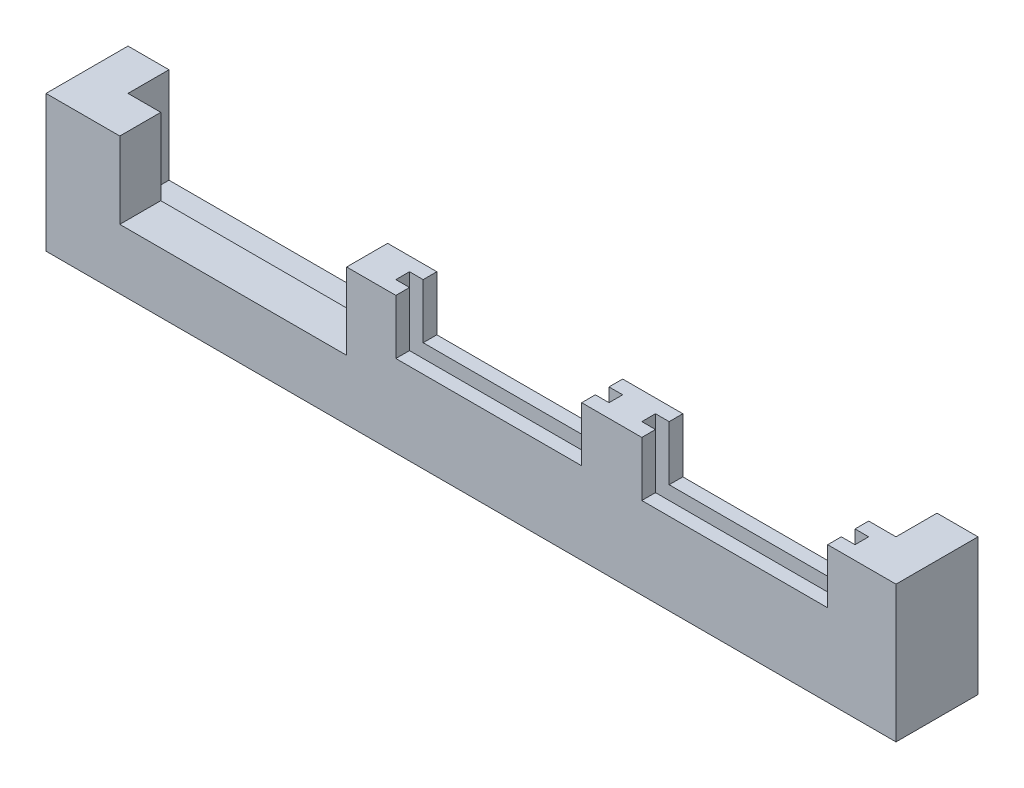
ISO-10303-21;
HEADER;
FILE_DESCRIPTION(('STEP AP214'),'2;1');
FILE_NAME('part.step','',(''),(''),'','','');
FILE_SCHEMA(('AUTOMOTIVE_DESIGN { 1 0 10303 214 1 1 1 1 }'));
ENDSEC;
DATA;
#1=APPLICATION_CONTEXT('core data for automotive mechanical design processes');
#2=APPLICATION_PROTOCOL_DEFINITION('international standard','automotive_design',2000,#1);
#3=PRODUCT_CONTEXT('',#1,'mechanical');
#4=PRODUCT('Part','Part','',(#3));
#5=PRODUCT_RELATED_PRODUCT_CATEGORY('part','',(#4));
#6=PRODUCT_DEFINITION_FORMATION('','',#4);
#7=PRODUCT_DEFINITION_CONTEXT('part definition',#1,'design');
#8=PRODUCT_DEFINITION('design','',#6,#7);
#9=PRODUCT_DEFINITION_SHAPE('','',#8);
#10=(LENGTH_UNIT() NAMED_UNIT(*) SI_UNIT(.MILLI.,.METRE.));
#11=(NAMED_UNIT(*) PLANE_ANGLE_UNIT() SI_UNIT($,.RADIAN.));
#12=(NAMED_UNIT(*) SI_UNIT($,.STERADIAN.) SOLID_ANGLE_UNIT());
#13=UNCERTAINTY_MEASURE_WITH_UNIT(LENGTH_MEASURE(1.E-05),#10,'distance_accuracy_value','');
#14=(GEOMETRIC_REPRESENTATION_CONTEXT(3) GLOBAL_UNCERTAINTY_ASSIGNED_CONTEXT((#13)) GLOBAL_UNIT_ASSIGNED_CONTEXT((#10,
#11,#12)) REPRESENTATION_CONTEXT('',''));
#15=CARTESIAN_POINT('',(0.,0.,0.));
#16=DIRECTION('',(0.,0.,1.));
#17=DIRECTION('',(1.,0.,0.));
#18=AXIS2_PLACEMENT_3D('',#15,#16,#17);
#19=CARTESIAN_POINT('',(27.8217270194986,-10.8422780020317,3.));
#20=DIRECTION('',(1.,0.,0.));
#21=DIRECTION('',(0.,1.,0.));
#22=AXIS2_PLACEMENT_3D('',#19,#20,#21);
#23=PLANE('',#22);
#24=DIRECTION('',(0.,0.,-1.));
#25=VECTOR('',#24,1.);
#26=CARTESIAN_POINT('',(27.8217270194986,-10.8422780020317,3.));
#27=LINE('',#26,#25);
#28=CARTESIAN_POINT('',(27.8217270194986,-10.8422780020317,3.));
#29=VERTEX_POINT('',#28);
#30=CARTESIAN_POINT('',(27.8217270194986,-10.8422780020317,2.));
#31=VERTEX_POINT('',#30);
#32=EDGE_CURVE('E482',#29,#31,#27,.T.);
#33=ORIENTED_EDGE('',*,*,#32,.T.);
#34=DIRECTION('',(0.,-1.,0.));
#35=VECTOR('',#34,1.);
#36=CARTESIAN_POINT('',(27.8217270194986,-10.8422780020317,2.));
#37=LINE('',#36,#35);
#38=CARTESIAN_POINT('',(27.8217270194986,-14.8422780020317,2.));
#39=VERTEX_POINT('',#38);
#40=EDGE_CURVE('E406',#31,#39,#37,.T.);
#41=ORIENTED_EDGE('',*,*,#40,.T.);
#42=DIRECTION('',(0.,0.,-1.));
#43=VECTOR('',#42,1.);
#44=CARTESIAN_POINT('',(27.8217270194986,-14.8422780020317,3.));
#45=LINE('',#44,#43);
#46=CARTESIAN_POINT('',(27.8217270194986,-14.8422780020317,3.));
#47=VERTEX_POINT('',#46);
#48=EDGE_CURVE('E486',#47,#39,#45,.T.);
#49=ORIENTED_EDGE('',*,*,#48,.F.);
#50=DIRECTION('',(0.,-1.,0.));
#51=VECTOR('',#50,1.);
#52=CARTESIAN_POINT('',(27.8217270194986,-10.8422780020317,3.));
#53=LINE('',#52,#51);
#54=EDGE_CURVE('E282',#29,#47,#53,.T.);
#55=ORIENTED_EDGE('',*,*,#54,.F.);
#56=EDGE_LOOP('',(#33,#41,#49,#55));
#57=FACE_BOUND('',#56,.T.);
#58=ADVANCED_FACE('F36',(#57),#23,.F.);
#59=CARTESIAN_POINT('',(14.2217270194986,-14.8422780020317,3.));
#60=DIRECTION('',(0.,1.,0.));
#61=DIRECTION('',(-1.,0.,0.));
#62=AXIS2_PLACEMENT_3D('',#59,#60,#61);
#63=PLANE('',#62);
#64=DIRECTION('',(1.,0.,0.));
#65=VECTOR('',#64,1.);
#66=CARTESIAN_POINT('',(14.2217270194986,-14.8422780020317,2.));
#67=LINE('',#66,#65);
#68=CARTESIAN_POINT('',(14.2217270194986,-14.8422780020317,2.));
#69=VERTEX_POINT('',#68);
#70=EDGE_CURVE('E404',#69,#39,#67,.T.);
#71=ORIENTED_EDGE('',*,*,#70,.F.);
#72=DIRECTION('',(0.,0.,-1.));
#73=VECTOR('',#72,1.);
#74=CARTESIAN_POINT('',(14.2217270194986,-14.8422780020317,3.));
#75=LINE('',#74,#73);
#76=CARTESIAN_POINT('',(14.2217270194986,-14.8422780020317,3.));
#77=VERTEX_POINT('',#76);
#78=EDGE_CURVE('E490',#77,#69,#75,.T.);
#79=ORIENTED_EDGE('',*,*,#78,.F.);
#80=DIRECTION('',(1.,0.,0.));
#81=VECTOR('',#80,1.);
#82=CARTESIAN_POINT('',(14.2217270194986,-14.8422780020317,3.));
#83=LINE('',#82,#81);
#84=EDGE_CURVE('E444',#77,#47,#83,.T.);
#85=ORIENTED_EDGE('',*,*,#84,.T.);
#86=ORIENTED_EDGE('',*,*,#48,.T.);
#87=EDGE_LOOP('',(#71,#79,#85,#86));
#88=FACE_BOUND('',#87,.T.);
#89=ADVANCED_FACE('F643',(#88),#63,.T.);
#90=CARTESIAN_POINT('',(14.2217270194986,-10.8422780020317,3.));
#91=DIRECTION('',(1.,0.,0.));
#92=DIRECTION('',(0.,0.,-1.));
#93=AXIS2_PLACEMENT_3D('',#90,#91,#92);
#94=PLANE('',#93);
#95=DIRECTION('',(0.,-1.,0.));
#96=VECTOR('',#95,1.);
#97=CARTESIAN_POINT('',(14.2217270194986,-10.8422780020317,2.));
#98=LINE('',#97,#96);
#99=CARTESIAN_POINT('',(14.2217270194986,-10.8422780020317,2.));
#100=VERTEX_POINT('',#99);
#101=EDGE_CURVE('E402',#100,#69,#98,.T.);
#102=ORIENTED_EDGE('',*,*,#101,.F.);
#103=DIRECTION('',(0.,0.,-1.));
#104=VECTOR('',#103,1.);
#105=CARTESIAN_POINT('',(14.2217270194986,-10.8422780020317,3.));
#106=LINE('',#105,#104);
#107=CARTESIAN_POINT('',(14.2217270194986,-10.8422780020317,3.));
#108=VERTEX_POINT('',#107);
#109=EDGE_CURVE('E494',#108,#100,#106,.T.);
#110=ORIENTED_EDGE('',*,*,#109,.F.);
#111=DIRECTION('',(0.,-1.,0.));
#112=VECTOR('',#111,1.);
#113=CARTESIAN_POINT('',(14.2217270194986,-10.8422780020317,3.));
#114=LINE('',#113,#112);
#115=EDGE_CURVE('E441',#108,#77,#114,.T.);
#116=ORIENTED_EDGE('',*,*,#115,.T.);
#117=ORIENTED_EDGE('',*,*,#78,.T.);
#118=EDGE_LOOP('',(#102,#110,#116,#117));
#119=FACE_BOUND('',#118,.T.);
#120=ADVANCED_FACE('F649',(#119),#94,.T.);
#121=CARTESIAN_POINT('',(9.82172701949864,-10.8422780020317,3.));
#122=DIRECTION('',(1.,0.,0.));
#123=DIRECTION('',(0.,0.,-1.));
#124=AXIS2_PLACEMENT_3D('',#121,#122,#123);
#125=PLANE('',#124);
#126=DIRECTION('',(0.,0.,-1.));
#127=VECTOR('',#126,1.);
#128=CARTESIAN_POINT('',(9.82172701949864,-14.8422780020317,3.));
#129=LINE('',#128,#127);
#130=CARTESIAN_POINT('',(9.82172701949864,-14.8422780020317,0.999999999999991));
#131=VERTEX_POINT('',#130);
#132=CARTESIAN_POINT('',(9.82172701949864,-14.8422780020317,0.));
#133=VERTEX_POINT('',#132);
#134=EDGE_CURVE('E505',#131,#133,#129,.T.);
#135=ORIENTED_EDGE('',*,*,#134,.F.);
#136=DIRECTION('',(0.,1.,0.));
#137=VECTOR('',#136,1.);
#138=CARTESIAN_POINT('',(9.82172701949864,-10.8422780020317,0.999999999999991));
#139=LINE('',#138,#137);
#140=CARTESIAN_POINT('',(9.82172701949864,-10.8422780020317,0.999999999999991));
#141=VERTEX_POINT('',#140);
#142=EDGE_CURVE('E392',#131,#141,#139,.T.);
#143=ORIENTED_EDGE('',*,*,#142,.T.);
#144=DIRECTION('',(0.,0.,-1.));
#145=VECTOR('',#144,1.);
#146=CARTESIAN_POINT('',(9.82172701949864,-10.8422780020317,3.));
#147=LINE('',#146,#145);
#148=CARTESIAN_POINT('',(9.82172701949864,-10.8422780020317,0.));
#149=VERTEX_POINT('',#148);
#150=EDGE_CURVE('E501',#141,#149,#147,.T.);
#151=ORIENTED_EDGE('',*,*,#150,.T.);
#152=DIRECTION('',(0.,-1.,0.));
#153=VECTOR('',#152,1.);
#154=CARTESIAN_POINT('',(9.82172701949864,-10.8422780020317,0.));
#155=LINE('',#154,#153);
#156=EDGE_CURVE('E466',#149,#133,#155,.T.);
#157=ORIENTED_EDGE('',*,*,#156,.T.);
#158=EDGE_LOOP('',(#135,#143,#151,#157));
#159=FACE_BOUND('',#158,.T.);
#160=ADVANCED_FACE('F594',(#159),#125,.F.);
#161=CARTESIAN_POINT('',(-3.77827298050137,-14.8422780020317,3.));
#162=DIRECTION('',(0.,1.,0.));
#163=DIRECTION('',(0.,0.,1.));
#164=AXIS2_PLACEMENT_3D('',#161,#162,#163);
#165=PLANE('',#164);
#166=DIRECTION('',(-1.,0.,0.));
#167=VECTOR('',#166,1.);
#168=CARTESIAN_POINT('',(-3.77827298050137,-14.8422780020317,1.));
#169=LINE('',#168,#167);
#170=CARTESIAN_POINT('',(-3.77827298050137,-14.8422780020317,1.));
#171=VERTEX_POINT('',#170);
#172=EDGE_CURVE('E390',#131,#171,#169,.T.);
#173=ORIENTED_EDGE('',*,*,#172,.F.);
#174=ORIENTED_EDGE('',*,*,#134,.T.);
#175=DIRECTION('',(1.,0.,0.));
#176=VECTOR('',#175,1.);
#177=CARTESIAN_POINT('',(-3.77827298050137,-14.8422780020317,0.));
#178=LINE('',#177,#176);
#179=CARTESIAN_POINT('',(-3.77827298050137,-14.8422780020317,0.));
#180=VERTEX_POINT('',#179);
#181=EDGE_CURVE('E463',#180,#133,#178,.T.);
#182=ORIENTED_EDGE('',*,*,#181,.F.);
#183=DIRECTION('',(0.,0.,-1.));
#184=VECTOR('',#183,1.);
#185=CARTESIAN_POINT('',(-3.77827298050137,-14.8422780020317,3.));
#186=LINE('',#185,#184);
#187=EDGE_CURVE('E509',#171,#180,#186,.T.);
#188=ORIENTED_EDGE('',*,*,#187,.F.);
#189=EDGE_LOOP('',(#173,#174,#182,#188));
#190=FACE_BOUND('',#189,.T.);
#191=ADVANCED_FACE('F661',(#190),#165,.T.);
#192=CARTESIAN_POINT('',(-3.77827298050137,-10.8422780020317,3.));
#193=DIRECTION('',(1.,0.,0.));
#194=DIRECTION('',(0.,1.,0.));
#195=AXIS2_PLACEMENT_3D('',#192,#193,#194);
#196=PLANE('',#195);
#197=DIRECTION('',(0.,1.,0.));
#198=VECTOR('',#197,1.);
#199=CARTESIAN_POINT('',(-3.77827298050137,-10.8422780020317,1.));
#200=LINE('',#199,#198);
#201=CARTESIAN_POINT('',(-3.77827298050137,-10.8422780020317,0.999999999999999));
#202=VERTEX_POINT('',#201);
#203=EDGE_CURVE('E388',#171,#202,#200,.T.);
#204=ORIENTED_EDGE('',*,*,#203,.F.);
#205=ORIENTED_EDGE('',*,*,#187,.T.);
#206=DIRECTION('',(0.,-1.,0.));
#207=VECTOR('',#206,1.);
#208=CARTESIAN_POINT('',(-3.77827298050137,-10.8422780020317,0.));
#209=LINE('',#208,#207);
#210=CARTESIAN_POINT('',(-3.77827298050137,-10.8422780020317,0.));
#211=VERTEX_POINT('',#210);
#212=EDGE_CURVE('E460',#211,#180,#209,.T.);
#213=ORIENTED_EDGE('',*,*,#212,.F.);
#214=DIRECTION('',(0.,0.,-1.));
#215=VECTOR('',#214,1.);
#216=CARTESIAN_POINT('',(-3.77827298050137,-10.8422780020317,3.));
#217=LINE('',#216,#215);
#218=EDGE_CURVE('E513',#202,#211,#217,.T.);
#219=ORIENTED_EDGE('',*,*,#218,.F.);
#220=EDGE_LOOP('',(#204,#205,#213,#219));
#221=FACE_BOUND('',#220,.T.);
#222=ADVANCED_FACE('F539',(#221),#196,.T.);
#223=CARTESIAN_POINT('',(29.8217270194986,-10.8422780020317,3.));
#224=DIRECTION('',(0.,-1.,0.));
#225=DIRECTION('',(0.,0.,-1.));
#226=AXIS2_PLACEMENT_3D('',#223,#224,#225);
#227=PLANE('',#226);
#228=DIRECTION('',(0.,0.,-1.));
#229=VECTOR('',#228,1.);
#230=CARTESIAN_POINT('',(28.8217270194986,-10.8422780020317,1.));
#231=LINE('',#230,#229);
#232=CARTESIAN_POINT('',(28.8217270194986,-10.8422780020317,2.));
#233=VERTEX_POINT('',#232);
#234=CARTESIAN_POINT('',(28.8217270194986,-10.8422780020317,1.));
#235=VERTEX_POINT('',#234);
#236=EDGE_CURVE('E364',#233,#235,#231,.T.);
#237=ORIENTED_EDGE('',*,*,#236,.F.);
#238=DIRECTION('',(1.,0.,0.));
#239=VECTOR('',#238,1.);
#240=CARTESIAN_POINT('',(13.2217270194986,-10.8422780020317,2.));
#241=LINE('',#240,#239);
#242=EDGE_CURVE('E323',#31,#233,#241,.T.);
#243=ORIENTED_EDGE('',*,*,#242,.F.);
#244=ORIENTED_EDGE('',*,*,#32,.F.);
#245=DIRECTION('',(1.,0.,0.));
#246=VECTOR('',#245,1.);
#247=CARTESIAN_POINT('',(29.8217270194986,-10.8422780020317,3.));
#248=LINE('',#247,#246);
#249=CARTESIAN_POINT('',(32.8217270194986,-10.8422780020317,3.));
#250=VERTEX_POINT('',#249);
#251=EDGE_CURVE('E277',#29,#250,#248,.T.);
#252=ORIENTED_EDGE('',*,*,#251,.T.);
#253=DIRECTION('',(0.,0.,-1.));
#254=VECTOR('',#253,1.);
#255=CARTESIAN_POINT('',(32.8217270194986,-10.8422780020317,3.));
#256=LINE('',#255,#254);
#257=CARTESIAN_POINT('',(32.8217270194986,-10.8422780020317,-3.));
#258=VERTEX_POINT('',#257);
#259=EDGE_CURVE('E269',#250,#258,#256,.T.);
#260=ORIENTED_EDGE('',*,*,#259,.T.);
#261=DIRECTION('',(1.,0.,0.));
#262=VECTOR('',#261,1.);
#263=CARTESIAN_POINT('',(29.8217270194986,-10.8422780020317,-3.));
#264=LINE('',#263,#262);
#265=CARTESIAN_POINT('',(29.8217270194986,-10.8422780020317,-3.));
#266=VERTEX_POINT('',#265);
#267=EDGE_CURVE('E275',#266,#258,#264,.T.);
#268=ORIENTED_EDGE('',*,*,#267,.F.);
#269=DIRECTION('',(0.,0.,1.));
#270=VECTOR('',#269,1.);
#271=CARTESIAN_POINT('',(29.8217270194986,-10.8422780020317,-3.));
#272=LINE('',#271,#270);
#273=CARTESIAN_POINT('',(29.8217270194986,-10.8422780020317,0.));
#274=VERTEX_POINT('',#273);
#275=EDGE_CURVE('E310',#266,#274,#272,.T.);
#276=ORIENTED_EDGE('',*,*,#275,.T.);
#277=DIRECTION('',(-1.,0.,0.));
#278=VECTOR('',#277,1.);
#279=CARTESIAN_POINT('',(29.8217270194986,-10.8422780020317,0.));
#280=LINE('',#279,#278);
#281=CARTESIAN_POINT('',(27.8217270194986,-10.8422780020317,0.));
#282=VERTEX_POINT('',#281);
#283=EDGE_CURVE('E412',#274,#282,#280,.T.);
#284=ORIENTED_EDGE('',*,*,#283,.T.);
#285=CARTESIAN_POINT('',(27.8217270194986,-10.8422780020317,1.));
#286=VERTEX_POINT('',#285);
#287=EDGE_CURVE('E485',#286,#282,#27,.T.);
#288=ORIENTED_EDGE('',*,*,#287,.F.);
#289=DIRECTION('',(-1.,0.,0.));
#290=VECTOR('',#289,1.);
#291=CARTESIAN_POINT('',(13.2217270194986,-10.8422780020317,1.));
#292=LINE('',#291,#290);
#293=EDGE_CURVE('E367',#235,#286,#292,.T.);
#294=ORIENTED_EDGE('',*,*,#293,.F.);
#295=EDGE_LOOP('',(#237,#243,#244,#252,#260,#268,#276,#284,#288,#294));
#296=FACE_BOUND('',#295,.T.);
#297=ADVANCED_FACE('F272',(#296),#227,.F.);
#298=CARTESIAN_POINT('',(27.8217270194986,-14.8422780020317,1.));
#299=VERTEX_POINT('',#298);
#300=CARTESIAN_POINT('',(27.8217270194986,-14.8422780020317,0.));
#301=VERTEX_POINT('',#300);
#302=EDGE_CURVE('E489',#299,#301,#45,.T.);
#303=ORIENTED_EDGE('',*,*,#302,.F.);
#304=DIRECTION('',(0.,1.,0.));
#305=VECTOR('',#304,1.);
#306=CARTESIAN_POINT('',(27.8217270194986,-10.8422780020317,1.));
#307=LINE('',#306,#305);
#308=EDGE_CURVE('E399',#299,#286,#307,.T.);
#309=ORIENTED_EDGE('',*,*,#308,.T.);
#310=ORIENTED_EDGE('',*,*,#287,.T.);
#311=DIRECTION('',(0.,-1.,0.));
#312=VECTOR('',#311,1.);
#313=CARTESIAN_POINT('',(27.8217270194986,-10.8422780020317,0.));
#314=LINE('',#313,#312);
#315=EDGE_CURVE('E478',#282,#301,#314,.T.);
#316=ORIENTED_EDGE('',*,*,#315,.T.);
#317=EDGE_LOOP('',(#303,#309,#310,#316));
#318=FACE_BOUND('',#317,.T.);
#319=ADVANCED_FACE('F610',(#318),#23,.F.);
#320=DIRECTION('',(-1.,0.,0.));
#321=VECTOR('',#320,1.);
#322=CARTESIAN_POINT('',(14.2217270194986,-14.8422780020317,1.));
#323=LINE('',#322,#321);
#324=CARTESIAN_POINT('',(14.2217270194986,-14.8422780020317,1.));
#325=VERTEX_POINT('',#324);
#326=EDGE_CURVE('E397',#299,#325,#323,.T.);
#327=ORIENTED_EDGE('',*,*,#326,.F.);
#328=ORIENTED_EDGE('',*,*,#302,.T.);
#329=DIRECTION('',(1.,0.,0.));
#330=VECTOR('',#329,1.);
#331=CARTESIAN_POINT('',(14.2217270194986,-14.8422780020317,0.));
#332=LINE('',#331,#330);
#333=CARTESIAN_POINT('',(14.2217270194986,-14.8422780020317,0.));
#334=VERTEX_POINT('',#333);
#335=EDGE_CURVE('E475',#334,#301,#332,.T.);
#336=ORIENTED_EDGE('',*,*,#335,.F.);
#337=EDGE_CURVE('E493',#325,#334,#75,.T.);
#338=ORIENTED_EDGE('',*,*,#337,.F.);
#339=EDGE_LOOP('',(#327,#328,#336,#338));
#340=FACE_BOUND('',#339,.T.);
#341=ADVANCED_FACE('F605',(#340),#63,.T.);
#342=DIRECTION('',(0.,1.,0.));
#343=VECTOR('',#342,1.);
#344=CARTESIAN_POINT('',(14.2217270194986,-10.8422780020317,1.));
#345=LINE('',#344,#343);
#346=CARTESIAN_POINT('',(14.2217270194986,-10.8422780020317,1.));
#347=VERTEX_POINT('',#346);
#348=EDGE_CURVE('E395',#325,#347,#345,.T.);
#349=ORIENTED_EDGE('',*,*,#348,.F.);
#350=ORIENTED_EDGE('',*,*,#337,.T.);
#351=DIRECTION('',(0.,-1.,0.));
#352=VECTOR('',#351,1.);
#353=CARTESIAN_POINT('',(14.2217270194986,-10.8422780020317,0.));
#354=LINE('',#353,#352);
#355=CARTESIAN_POINT('',(14.2217270194986,-10.8422780020317,0.));
#356=VERTEX_POINT('',#355);
#357=EDGE_CURVE('E472',#356,#334,#354,.T.);
#358=ORIENTED_EDGE('',*,*,#357,.F.);
#359=EDGE_CURVE('E497',#347,#356,#106,.T.);
#360=ORIENTED_EDGE('',*,*,#359,.F.);
#361=EDGE_LOOP('',(#349,#350,#358,#360));
#362=FACE_BOUND('',#361,.T.);
#363=ADVANCED_FACE('F600',(#362),#94,.T.);
#364=CARTESIAN_POINT('',(14.2217270194986,-10.8422780020317,3.));
#365=DIRECTION('',(0.,-1.,0.));
#366=DIRECTION('',(1.,0.,0.));
#367=AXIS2_PLACEMENT_3D('',#364,#365,#366);
#368=PLANE('',#367);
#369=ORIENTED_EDGE('',*,*,#150,.F.);
#370=DIRECTION('',(-1.,0.,0.));
#371=VECTOR('',#370,1.);
#372=CARTESIAN_POINT('',(-4.77827298050137,-10.8422780020317,1.));
#373=LINE('',#372,#371);
#374=CARTESIAN_POINT('',(10.8217270194986,-10.8422780020317,0.99999999999999));
#375=VERTEX_POINT('',#374);
#376=EDGE_CURVE('E341',#375,#141,#373,.T.);
#377=ORIENTED_EDGE('',*,*,#376,.F.);
#378=DIRECTION('',(0.,0.,-1.));
#379=VECTOR('',#378,1.);
#380=CARTESIAN_POINT('',(10.8217270194986,-10.8422780020317,0.99999999999999));
#381=LINE('',#380,#379);
#382=CARTESIAN_POINT('',(10.8217270194986,-10.8422780020317,2.));
#383=VERTEX_POINT('',#382);
#384=EDGE_CURVE('E338',#383,#375,#381,.T.);
#385=ORIENTED_EDGE('',*,*,#384,.F.);
#386=DIRECTION('',(1.,0.,0.));
#387=VECTOR('',#386,1.);
#388=CARTESIAN_POINT('',(-4.77827298050137,-10.8422780020317,2.));
#389=LINE('',#388,#387);
#390=CARTESIAN_POINT('',(9.82172701949864,-10.8422780020317,2.));
#391=VERTEX_POINT('',#390);
#392=EDGE_CURVE('E334',#391,#383,#389,.T.);
#393=ORIENTED_EDGE('',*,*,#392,.F.);
#394=CARTESIAN_POINT('',(9.82172701949864,-10.8422780020317,3.));
#395=VERTEX_POINT('',#394);
#396=EDGE_CURVE('E498',#395,#391,#147,.T.);
#397=ORIENTED_EDGE('',*,*,#396,.F.);
#398=DIRECTION('',(-1.,0.,0.));
#399=VECTOR('',#398,1.);
#400=CARTESIAN_POINT('',(14.2217270194986,-10.8422780020317,3.));
#401=LINE('',#400,#399);
#402=EDGE_CURVE('E439',#108,#395,#401,.T.);
#403=ORIENTED_EDGE('',*,*,#402,.F.);
#404=ORIENTED_EDGE('',*,*,#109,.T.);
#405=CARTESIAN_POINT('',(13.2217270194986,-10.8422780020317,2.));
#406=VERTEX_POINT('',#405);
#407=EDGE_CURVE('E362',#406,#100,#241,.T.);
#408=ORIENTED_EDGE('',*,*,#407,.F.);
#409=DIRECTION('',(0.,0.,1.));
#410=VECTOR('',#409,1.);
#411=CARTESIAN_POINT('',(13.2217270194986,-10.8422780020317,1.));
#412=LINE('',#411,#410);
#413=CARTESIAN_POINT('',(13.2217270194986,-10.8422780020317,1.));
#414=VERTEX_POINT('',#413);
#415=EDGE_CURVE('E369',#414,#406,#412,.T.);
#416=ORIENTED_EDGE('',*,*,#415,.F.);
#417=DIRECTION('',(1.,0.,0.));
#418=VECTOR('',#417,1.);
#419=CARTESIAN_POINT('',(14.2217270194986,-10.8422780020317,1.));
#420=LINE('',#419,#418);
#421=EDGE_CURVE('E13',#414,#347,#420,.T.);
#422=ORIENTED_EDGE('',*,*,#421,.T.);
#423=ORIENTED_EDGE('',*,*,#359,.T.);
#424=DIRECTION('',(-1.,0.,0.));
#425=VECTOR('',#424,1.);
#426=CARTESIAN_POINT('',(14.2217270194986,-10.8422780020317,0.));
#427=LINE('',#426,#425);
#428=EDGE_CURVE('E469',#356,#149,#427,.T.);
#429=ORIENTED_EDGE('',*,*,#428,.T.);
#430=EDGE_LOOP('',(#369,#377,#385,#393,#397,#403,#404,#408,#416,#422,#423,#429));
#431=FACE_BOUND('',#430,.T.);
#432=ADVANCED_FACE('F575',(#431),#368,.F.);
#433=ORIENTED_EDGE('',*,*,#396,.T.);
#434=DIRECTION('',(0.,-1.,0.));
#435=VECTOR('',#434,1.);
#436=CARTESIAN_POINT('',(9.82172701949864,-10.8422780020317,2.));
#437=LINE('',#436,#435);
#438=CARTESIAN_POINT('',(9.82172701949864,-14.8422780020317,2.));
#439=VERTEX_POINT('',#438);
#440=EDGE_CURVE('E385',#391,#439,#437,.T.);
#441=ORIENTED_EDGE('',*,*,#440,.T.);
#442=CARTESIAN_POINT('',(9.82172701949864,-14.8422780020317,3.));
#443=VERTEX_POINT('',#442);
#444=EDGE_CURVE('E502',#443,#439,#129,.T.);
#445=ORIENTED_EDGE('',*,*,#444,.F.);
#446=DIRECTION('',(0.,-1.,0.));
#447=VECTOR('',#446,1.);
#448=CARTESIAN_POINT('',(9.82172701949864,-10.8422780020317,3.));
#449=LINE('',#448,#447);
#450=EDGE_CURVE('E437',#395,#443,#449,.T.);
#451=ORIENTED_EDGE('',*,*,#450,.F.);
#452=EDGE_LOOP('',(#433,#441,#445,#451));
#453=FACE_BOUND('',#452,.T.);
#454=ADVANCED_FACE('F568',(#453),#125,.F.);
#455=DIRECTION('',(1.,0.,0.));
#456=VECTOR('',#455,1.);
#457=CARTESIAN_POINT('',(-3.77827298050137,-14.8422780020317,2.));
#458=LINE('',#457,#456);
#459=CARTESIAN_POINT('',(-3.77827298050137,-14.8422780020317,2.));
#460=VERTEX_POINT('',#459);
#461=EDGE_CURVE('E383',#460,#439,#458,.T.);
#462=ORIENTED_EDGE('',*,*,#461,.F.);
#463=CARTESIAN_POINT('',(-3.77827298050137,-14.8422780020317,3.));
#464=VERTEX_POINT('',#463);
#465=EDGE_CURVE('E506',#464,#460,#186,.T.);
#466=ORIENTED_EDGE('',*,*,#465,.F.);
#467=DIRECTION('',(1.,0.,0.));
#468=VECTOR('',#467,1.);
#469=CARTESIAN_POINT('',(-3.77827298050137,-14.8422780020317,3.));
#470=LINE('',#469,#468);
#471=EDGE_CURVE('E434',#464,#443,#470,.T.);
#472=ORIENTED_EDGE('',*,*,#471,.T.);
#473=ORIENTED_EDGE('',*,*,#444,.T.);
#474=EDGE_LOOP('',(#462,#466,#472,#473));
#475=FACE_BOUND('',#474,.T.);
#476=ADVANCED_FACE('F564',(#475),#165,.T.);
#477=DIRECTION('',(0.,-1.,0.));
#478=VECTOR('',#477,1.);
#479=CARTESIAN_POINT('',(-3.77827298050137,-10.8422780020317,2.));
#480=LINE('',#479,#478);
#481=CARTESIAN_POINT('',(-3.77827298050137,-10.8422780020317,2.));
#482=VERTEX_POINT('',#481);
#483=EDGE_CURVE('E354',#482,#460,#480,.T.);
#484=ORIENTED_EDGE('',*,*,#483,.F.);
#485=CARTESIAN_POINT('',(-3.77827298050137,-10.8422780020317,3.));
#486=VERTEX_POINT('',#485);
#487=EDGE_CURVE('E510',#486,#482,#217,.T.);
#488=ORIENTED_EDGE('',*,*,#487,.F.);
#489=DIRECTION('',(0.,-1.,0.));
#490=VECTOR('',#489,1.);
#491=CARTESIAN_POINT('',(-3.77827298050137,-10.8422780020317,3.));
#492=LINE('',#491,#490);
#493=EDGE_CURVE('E431',#486,#464,#492,.T.);
#494=ORIENTED_EDGE('',*,*,#493,.T.);
#495=ORIENTED_EDGE('',*,*,#465,.T.);
#496=EDGE_LOOP('',(#484,#488,#494,#495));
#497=FACE_BOUND('',#496,.T.);
#498=ADVANCED_FACE('F559',(#497),#196,.T.);
#499=CARTESIAN_POINT('',(-3.77827298050137,-10.8422780020317,3.));
#500=DIRECTION('',(0.,-1.,0.));
#501=DIRECTION('',(0.,0.,-1.));
#502=AXIS2_PLACEMENT_3D('',#499,#500,#501);
#503=PLANE('',#502);
#504=DIRECTION('',(0.,0.,1.));
#505=VECTOR('',#504,1.);
#506=CARTESIAN_POINT('',(-4.77827298050137,-10.8422780020317,1.));
#507=LINE('',#506,#505);
#508=CARTESIAN_POINT('',(-4.77827298050137,-10.8422780020317,1.));
#509=VERTEX_POINT('',#508);
#510=CARTESIAN_POINT('',(-4.77827298050137,-10.8422780020317,2.));
#511=VERTEX_POINT('',#510);
#512=EDGE_CURVE('E332',#509,#511,#507,.T.);
#513=ORIENTED_EDGE('',*,*,#512,.F.);
#514=DIRECTION('',(1.,0.,0.));
#515=VECTOR('',#514,1.);
#516=CARTESIAN_POINT('',(-3.77827298050137,-10.8422780020317,1.));
#517=LINE('',#516,#515);
#518=EDGE_CURVE('E44',#509,#202,#517,.T.);
#519=ORIENTED_EDGE('',*,*,#518,.T.);
#520=ORIENTED_EDGE('',*,*,#218,.T.);
#521=DIRECTION('',(-1.,0.,0.));
#522=VECTOR('',#521,1.);
#523=CARTESIAN_POINT('',(-3.77827298050137,-10.8422780020317,0.));
#524=LINE('',#523,#522);
#525=CARTESIAN_POINT('',(-7.37827298050137,-10.8422780020317,0.));
#526=VERTEX_POINT('',#525);
#527=EDGE_CURVE('E458',#211,#526,#524,.T.);
#528=ORIENTED_EDGE('',*,*,#527,.T.);
#529=DIRECTION('',(0.,0.,-1.));
#530=VECTOR('',#529,1.);
#531=CARTESIAN_POINT('',(-7.37827298050137,-10.8422780020317,3.));
#532=LINE('',#531,#530);
#533=CARTESIAN_POINT('',(-7.37827298050137,-10.8422780020317,3.));
#534=VERTEX_POINT('',#533);
#535=EDGE_CURVE('E514',#534,#526,#532,.T.);
#536=ORIENTED_EDGE('',*,*,#535,.F.);
#537=DIRECTION('',(-1.,0.,0.));
#538=VECTOR('',#537,1.);
#539=CARTESIAN_POINT('',(-3.77827298050137,-10.8422780020317,3.));
#540=LINE('',#539,#538);
#541=EDGE_CURVE('E429',#486,#534,#540,.T.);
#542=ORIENTED_EDGE('',*,*,#541,.F.);
#543=ORIENTED_EDGE('',*,*,#487,.T.);
#544=EDGE_CURVE('E336',#511,#482,#389,.T.);
#545=ORIENTED_EDGE('',*,*,#544,.F.);
#546=EDGE_LOOP('',(#513,#519,#520,#528,#536,#542,#543,#545));
#547=FACE_BOUND('',#546,.T.);
#548=ADVANCED_FACE('F531',(#547),#503,.F.);
#549=CARTESIAN_POINT('',(-7.37827298050137,-10.8422780020317,3.));
#550=DIRECTION('',(1.,0.,0.));
#551=DIRECTION('',(0.,0.,-1.));
#552=AXIS2_PLACEMENT_3D('',#549,#550,#551);
#553=PLANE('',#552);
#554=DIRECTION('',(0.,-1.,0.));
#555=VECTOR('',#554,1.);
#556=CARTESIAN_POINT('',(-7.37827298050137,-10.8422780020317,0.));
#557=LINE('',#556,#555);
#558=CARTESIAN_POINT('',(-7.37827298050137,-16.4422780020317,0.));
#559=VERTEX_POINT('',#558);
#560=EDGE_CURVE('E455',#526,#559,#557,.T.);
#561=ORIENTED_EDGE('',*,*,#560,.T.);
#562=DIRECTION('',(0.,0.,-1.));
#563=VECTOR('',#562,1.);
#564=CARTESIAN_POINT('',(-7.37827298050137,-16.4422780020317,3.));
#565=LINE('',#564,#563);
#566=CARTESIAN_POINT('',(-7.37827298050137,-16.4422780020317,3.));
#567=VERTEX_POINT('',#566);
#568=EDGE_CURVE('E517',#567,#559,#565,.T.);
#569=ORIENTED_EDGE('',*,*,#568,.F.);
#570=DIRECTION('',(0.,-1.,0.));
#571=VECTOR('',#570,1.);
#572=CARTESIAN_POINT('',(-7.37827298050137,-10.8422780020317,3.));
#573=LINE('',#572,#571);
#574=EDGE_CURVE('E427',#534,#567,#573,.T.);
#575=ORIENTED_EDGE('',*,*,#574,.F.);
#576=ORIENTED_EDGE('',*,*,#535,.T.);
#577=EDGE_LOOP('',(#561,#569,#575,#576));
#578=FACE_BOUND('',#577,.T.);
#579=ADVANCED_FACE('F549',(#578),#553,.F.);
#580=CARTESIAN_POINT('',(-23.9782729805014,-16.4422780020317,3.));
#581=DIRECTION('',(0.,1.,0.));
#582=DIRECTION('',(0.,0.,1.));
#583=AXIS2_PLACEMENT_3D('',#580,#581,#582);
#584=PLANE('',#583);
#585=DIRECTION('',(1.,0.,0.));
#586=VECTOR('',#585,1.);
#587=CARTESIAN_POINT('',(-23.9782729805014,-16.4422780020317,0.));
#588=LINE('',#587,#586);
#589=CARTESIAN_POINT('',(-23.9782729805014,-16.4422780020317,0.));
#590=VERTEX_POINT('',#589);
#591=EDGE_CURVE('E452',#590,#559,#588,.T.);
#592=ORIENTED_EDGE('',*,*,#591,.F.);
#593=DIRECTION('',(0.,0.,-1.));
#594=VECTOR('',#593,1.);
#595=CARTESIAN_POINT('',(-23.9782729805014,-16.4422780020317,3.));
#596=LINE('',#595,#594);
#597=CARTESIAN_POINT('',(-23.9782729805014,-16.4422780020317,3.));
#598=VERTEX_POINT('',#597);
#599=EDGE_CURVE('E519',#598,#590,#596,.T.);
#600=ORIENTED_EDGE('',*,*,#599,.F.);
#601=DIRECTION('',(1.,0.,0.));
#602=VECTOR('',#601,1.);
#603=CARTESIAN_POINT('',(-23.9782729805014,-16.4422780020317,3.));
#604=LINE('',#603,#602);
#605=EDGE_CURVE('E424',#598,#567,#604,.T.);
#606=ORIENTED_EDGE('',*,*,#605,.T.);
#607=ORIENTED_EDGE('',*,*,#568,.T.);
#608=EDGE_LOOP('',(#592,#600,#606,#607));
#609=FACE_BOUND('',#608,.T.);
#610=ADVANCED_FACE('F633',(#609),#584,.T.);
#611=CARTESIAN_POINT('',(-23.9782729805014,-10.8422780020317,3.));
#612=DIRECTION('',(1.,0.,0.));
#613=DIRECTION('',(0.,0.,-1.));
#614=AXIS2_PLACEMENT_3D('',#611,#612,#613);
#615=PLANE('',#614);
#616=DIRECTION('',(0.,-1.,0.));
#617=VECTOR('',#616,1.);
#618=CARTESIAN_POINT('',(-23.9782729805014,-10.8422780020317,0.));
#619=LINE('',#618,#617);
#620=CARTESIAN_POINT('',(-23.9782729805014,-10.8422780020317,0.));
#621=VERTEX_POINT('',#620);
#622=EDGE_CURVE('E449',#621,#590,#619,.T.);
#623=ORIENTED_EDGE('',*,*,#622,.F.);
#624=DIRECTION('',(0.,0.,-1.));
#625=VECTOR('',#624,1.);
#626=CARTESIAN_POINT('',(-23.9782729805014,-10.8422780020317,3.));
#627=LINE('',#626,#625);
#628=CARTESIAN_POINT('',(-23.9782729805014,-10.8422780020317,3.));
#629=VERTEX_POINT('',#628);
#630=EDGE_CURVE('E521',#629,#621,#627,.T.);
#631=ORIENTED_EDGE('',*,*,#630,.F.);
#632=DIRECTION('',(0.,-1.,0.));
#633=VECTOR('',#632,1.);
#634=CARTESIAN_POINT('',(-23.9782729805014,-10.8422780020317,3.));
#635=LINE('',#634,#633);
#636=EDGE_CURVE('E421',#629,#598,#635,.T.);
#637=ORIENTED_EDGE('',*,*,#636,.T.);
#638=ORIENTED_EDGE('',*,*,#599,.T.);
#639=EDGE_LOOP('',(#623,#631,#637,#638));
#640=FACE_BOUND('',#639,.T.);
#641=ADVANCED_FACE('F630',(#640),#615,.T.);
#642=CARTESIAN_POINT('',(-23.9782729805014,-10.8422780020317,3.));
#643=DIRECTION('',(0.,-1.,0.));
#644=DIRECTION('',(1.,0.,0.));
#645=AXIS2_PLACEMENT_3D('',#642,#643,#644);
#646=PLANE('',#645);
#647=DIRECTION('',(-1.,0.,0.));
#648=VECTOR('',#647,1.);
#649=CARTESIAN_POINT('',(-23.9782729805014,-10.8422780020317,0.));
#650=LINE('',#649,#648);
#651=CARTESIAN_POINT('',(-26.3782729805014,-10.8422780020317,0.));
#652=VERTEX_POINT('',#651);
#653=EDGE_CURVE('E409',#621,#652,#650,.T.);
#654=ORIENTED_EDGE('',*,*,#653,.T.);
#655=DIRECTION('',(0.,0.,1.));
#656=VECTOR('',#655,1.);
#657=CARTESIAN_POINT('',(-26.3782729805014,-10.8422780020317,-3.));
#658=LINE('',#657,#656);
#659=CARTESIAN_POINT('',(-26.3782729805014,-10.8422780020317,-3.));
#660=VERTEX_POINT('',#659);
#661=EDGE_CURVE('E320',#660,#652,#658,.T.);
#662=ORIENTED_EDGE('',*,*,#661,.F.);
#663=DIRECTION('',(1.,0.,0.));
#664=VECTOR('',#663,1.);
#665=CARTESIAN_POINT('',(-29.3782729805014,-10.8422780020317,-3.));
#666=LINE('',#665,#664);
#667=CARTESIAN_POINT('',(-29.3782729805014,-10.8422780020317,-3.));
#668=VERTEX_POINT('',#667);
#669=EDGE_CURVE('E303',#668,#660,#666,.T.);
#670=ORIENTED_EDGE('',*,*,#669,.F.);
#671=DIRECTION('',(0.,0.,-1.));
#672=VECTOR('',#671,1.);
#673=CARTESIAN_POINT('',(-29.3782729805014,-10.8422780020317,3.));
#674=LINE('',#673,#672);
#675=CARTESIAN_POINT('',(-29.3782729805014,-10.8422780020317,3.));
#676=VERTEX_POINT('',#675);
#677=EDGE_CURVE('E523',#676,#668,#674,.T.);
#678=ORIENTED_EDGE('',*,*,#677,.F.);
#679=DIRECTION('',(1.,0.,0.));
#680=VECTOR('',#679,1.);
#681=CARTESIAN_POINT('',(-29.3782729805014,-10.8422780020317,3.));
#682=LINE('',#681,#680);
#683=EDGE_CURVE('E419',#676,#629,#682,.T.);
#684=ORIENTED_EDGE('',*,*,#683,.T.);
#685=ORIENTED_EDGE('',*,*,#630,.T.);
#686=EDGE_LOOP('',(#654,#662,#670,#678,#684,#685));
#687=FACE_BOUND('',#686,.T.);
#688=ADVANCED_FACE('F626',(#687),#646,.F.);
#689=CARTESIAN_POINT('',(-29.3782729805014,-20.8422780020317,3.));
#690=DIRECTION('',(-1.,0.,0.));
#691=DIRECTION('',(0.,0.,1.));
#692=AXIS2_PLACEMENT_3D('',#689,#690,#691);
#693=PLANE('',#692);
#694=ORIENTED_EDGE('',*,*,#677,.T.);
#695=DIRECTION('',(0.,1.,0.));
#696=VECTOR('',#695,1.);
#697=CARTESIAN_POINT('',(-29.3782729805014,-20.8422780020317,-3.));
#698=LINE('',#697,#696);
#699=CARTESIAN_POINT('',(-29.3782729805014,-20.8422780020317,-3.));
#700=VERTEX_POINT('',#699);
#701=EDGE_CURVE('E300',#700,#668,#698,.T.);
#702=ORIENTED_EDGE('',*,*,#701,.F.);
#703=DIRECTION('',(0.,0.,-1.));
#704=VECTOR('',#703,1.);
#705=CARTESIAN_POINT('',(-29.3782729805014,-20.8422780020317,3.));
#706=LINE('',#705,#704);
#707=CARTESIAN_POINT('',(-29.3782729805014,-20.8422780020317,3.));
#708=VERTEX_POINT('',#707);
#709=EDGE_CURVE('E525',#708,#700,#706,.T.);
#710=ORIENTED_EDGE('',*,*,#709,.F.);
#711=DIRECTION('',(0.,1.,0.));
#712=VECTOR('',#711,1.);
#713=CARTESIAN_POINT('',(-29.3782729805014,-20.8422780020317,3.));
#714=LINE('',#713,#712);
#715=EDGE_CURVE('E416',#708,#676,#714,.T.);
#716=ORIENTED_EDGE('',*,*,#715,.T.);
#717=EDGE_LOOP('',(#694,#702,#710,#716));
#718=FACE_BOUND('',#717,.T.);
#719=ADVANCED_FACE('F781',(#718),#693,.T.);
#720=CARTESIAN_POINT('',(-26.3782729805014,-20.8422780020317,3.));
#721=DIRECTION('',(0.,-1.,0.));
#722=DIRECTION('',(0.,0.,-1.));
#723=AXIS2_PLACEMENT_3D('',#720,#721,#722);
#724=PLANE('',#723);
#725=ORIENTED_EDGE('',*,*,#709,.T.);
#726=DIRECTION('',(-1.,0.,0.));
#727=VECTOR('',#726,1.);
#728=CARTESIAN_POINT('',(32.8217270194986,-20.8422780020317,-3.));
#729=LINE('',#728,#727);
#730=CARTESIAN_POINT('',(32.8217270194986,-20.8422780020317,-3.));
#731=VERTEX_POINT('',#730);
#732=EDGE_CURVE('E289',#731,#700,#729,.T.);
#733=ORIENTED_EDGE('',*,*,#732,.F.);
#734=DIRECTION('',(0.,0.,-1.));
#735=VECTOR('',#734,1.);
#736=CARTESIAN_POINT('',(32.8217270194986,-20.8422780020317,3.));
#737=LINE('',#736,#735);
#738=CARTESIAN_POINT('',(32.8217270194986,-20.8422780020317,3.));
#739=VERTEX_POINT('',#738);
#740=EDGE_CURVE('E281',#739,#731,#737,.T.);
#741=ORIENTED_EDGE('',*,*,#740,.F.);
#742=DIRECTION('',(-1.,0.,0.));
#743=VECTOR('',#742,1.);
#744=CARTESIAN_POINT('',(32.8217270194986,-20.8422780020317,3.));
#745=LINE('',#744,#743);
#746=EDGE_CURVE('E414',#739,#708,#745,.T.);
#747=ORIENTED_EDGE('',*,*,#746,.T.);
#748=EDGE_LOOP('',(#725,#733,#741,#747));
#749=FACE_BOUND('',#748,.T.);
#750=ADVANCED_FACE('F775',(#749),#724,.T.);
#751=CARTESIAN_POINT('',(32.8217270194986,-10.8422780020317,3.));
#752=DIRECTION('',(1.,0.,0.));
#753=DIRECTION('',(0.,0.,-1.));
#754=AXIS2_PLACEMENT_3D('',#751,#752,#753);
#755=PLANE('',#754);
#756=ORIENTED_EDGE('',*,*,#740,.T.);
#757=DIRECTION('',(0.,-1.,0.));
#758=VECTOR('',#757,1.);
#759=CARTESIAN_POINT('',(32.8217270194986,-10.8422780020317,-3.));
#760=LINE('',#759,#758);
#761=EDGE_CURVE('E285',#258,#731,#760,.T.);
#762=ORIENTED_EDGE('',*,*,#761,.F.);
#763=ORIENTED_EDGE('',*,*,#259,.F.);
#764=DIRECTION('',(0.,-1.,0.));
#765=VECTOR('',#764,1.);
#766=CARTESIAN_POINT('',(32.8217270194986,-10.8422780020317,3.));
#767=LINE('',#766,#765);
#768=EDGE_CURVE('E411',#250,#739,#767,.T.);
#769=ORIENTED_EDGE('',*,*,#768,.T.);
#770=EDGE_LOOP('',(#756,#762,#763,#769));
#771=FACE_BOUND('',#770,.T.);
#772=ADVANCED_FACE('F38',(#771),#755,.T.);
#773=CARTESIAN_POINT('',(0.,0.,3.));
#774=DIRECTION('',(0.,0.,-1.));
#775=DIRECTION('',(-1.,0.,0.));
#776=AXIS2_PLACEMENT_3D('',#773,#774,#775);
#777=PLANE('',#776);
#778=ORIENTED_EDGE('',*,*,#251,.F.);
#779=ORIENTED_EDGE('',*,*,#54,.T.);
#780=ORIENTED_EDGE('',*,*,#84,.F.);
#781=ORIENTED_EDGE('',*,*,#115,.F.);
#782=ORIENTED_EDGE('',*,*,#402,.T.);
#783=ORIENTED_EDGE('',*,*,#450,.T.);
#784=ORIENTED_EDGE('',*,*,#471,.F.);
#785=ORIENTED_EDGE('',*,*,#493,.F.);
#786=ORIENTED_EDGE('',*,*,#541,.T.);
#787=ORIENTED_EDGE('',*,*,#574,.T.);
#788=ORIENTED_EDGE('',*,*,#605,.F.);
#789=ORIENTED_EDGE('',*,*,#636,.F.);
#790=ORIENTED_EDGE('',*,*,#683,.F.);
#791=ORIENTED_EDGE('',*,*,#715,.F.);
#792=ORIENTED_EDGE('',*,*,#746,.F.);
#793=ORIENTED_EDGE('',*,*,#768,.F.);
#794=EDGE_LOOP('',(#778,#779,#780,#781,#782,#783,#784,#785,#786,#787,#788,#789,#790,#791,#792,#793));
#795=FACE_BOUND('',#794,.T.);
#796=ADVANCED_FACE('F553',(#795),#777,.F.);
#797=CARTESIAN_POINT('',(0.,0.,0.));
#798=DIRECTION('',(0.,0.,-1.));
#799=DIRECTION('',(-1.,0.,0.));
#800=AXIS2_PLACEMENT_3D('',#797,#798,#799);
#801=PLANE('',#800);
#802=DIRECTION('',(0.,1.,0.));
#803=VECTOR('',#802,1.);
#804=CARTESIAN_POINT('',(29.8217270194986,-17.8422780020317,0.));
#805=LINE('',#804,#803);
#806=CARTESIAN_POINT('',(29.8217270194986,-17.8422780020317,0.));
#807=VERTEX_POINT('',#806);
#808=EDGE_CURVE('E51',#807,#274,#805,.T.);
#809=ORIENTED_EDGE('',*,*,#808,.F.);
#810=DIRECTION('',(1.,0.,0.));
#811=VECTOR('',#810,1.);
#812=CARTESIAN_POINT('',(-26.3782729805014,-17.8422780020317,0.));
#813=LINE('',#812,#811);
#814=CARTESIAN_POINT('',(-26.3782729805014,-17.8422780020317,0.));
#815=VERTEX_POINT('',#814);
#816=EDGE_CURVE('E296',#815,#807,#813,.T.);
#817=ORIENTED_EDGE('',*,*,#816,.F.);
#818=DIRECTION('',(0.,-1.,0.));
#819=VECTOR('',#818,1.);
#820=CARTESIAN_POINT('',(-26.3782729805014,-10.8422780020317,0.));
#821=LINE('',#820,#819);
#822=EDGE_CURVE('E57',#652,#815,#821,.T.);
#823=ORIENTED_EDGE('',*,*,#822,.F.);
#824=ORIENTED_EDGE('',*,*,#653,.F.);
#825=ORIENTED_EDGE('',*,*,#622,.T.);
#826=ORIENTED_EDGE('',*,*,#591,.T.);
#827=ORIENTED_EDGE('',*,*,#560,.F.);
#828=ORIENTED_EDGE('',*,*,#527,.F.);
#829=ORIENTED_EDGE('',*,*,#212,.T.);
#830=ORIENTED_EDGE('',*,*,#181,.T.);
#831=ORIENTED_EDGE('',*,*,#156,.F.);
#832=ORIENTED_EDGE('',*,*,#428,.F.);
#833=ORIENTED_EDGE('',*,*,#357,.T.);
#834=ORIENTED_EDGE('',*,*,#335,.T.);
#835=ORIENTED_EDGE('',*,*,#315,.F.);
#836=ORIENTED_EDGE('',*,*,#283,.F.);
#837=EDGE_LOOP('',(#809,#817,#823,#824,#825,#826,#827,#828,#829,#830,#831,#832,#833,#834,#835,#836));
#838=FACE_BOUND('',#837,.T.);
#839=ADVANCED_FACE('F542',(#838),#801,.T.);
#840=CARTESIAN_POINT('',(-4.77827298050137,-32.4742964257671,1.));
#841=DIRECTION('',(0.,0.,-1.));
#842=DIRECTION('',(-1.,0.,0.));
#843=AXIS2_PLACEMENT_3D('',#840,#841,#842);
#844=PLANE('',#843);
#845=ORIENTED_EDGE('',*,*,#172,.T.);
#846=ORIENTED_EDGE('',*,*,#203,.T.);
#847=ORIENTED_EDGE('',*,*,#518,.F.);
#848=DIRECTION('',(0.,1.,0.));
#849=VECTOR('',#848,1.);
#850=CARTESIAN_POINT('',(-4.77827298050137,-32.4742964257671,1.));
#851=LINE('',#850,#849);
#852=CARTESIAN_POINT('',(-4.77827298050137,-15.8422780020317,1.));
#853=VERTEX_POINT('',#852);
#854=EDGE_CURVE('E327',#853,#509,#851,.T.);
#855=ORIENTED_EDGE('',*,*,#854,.F.);
#856=DIRECTION('',(1.,0.,0.));
#857=VECTOR('',#856,1.);
#858=CARTESIAN_POINT('',(-4.77827298050137,-15.8422780020317,1.));
#859=LINE('',#858,#857);
#860=CARTESIAN_POINT('',(10.8217270194986,-15.8422780020317,0.99999999999999));
#861=VERTEX_POINT('',#860);
#862=EDGE_CURVE('E326',#853,#861,#859,.T.);
#863=ORIENTED_EDGE('',*,*,#862,.T.);
#864=DIRECTION('',(0.,1.,0.));
#865=VECTOR('',#864,1.);
#866=CARTESIAN_POINT('',(10.8217270194986,-32.4742964257671,0.99999999999999));
#867=LINE('',#866,#865);
#868=EDGE_CURVE('E346',#861,#375,#867,.T.);
#869=ORIENTED_EDGE('',*,*,#868,.T.);
#870=ORIENTED_EDGE('',*,*,#376,.T.);
#871=ORIENTED_EDGE('',*,*,#142,.F.);
#872=EDGE_LOOP('',(#845,#846,#847,#855,#863,#869,#870,#871));
#873=FACE_BOUND('',#872,.T.);
#874=ADVANCED_FACE('F590',(#873),#844,.F.);
#875=CARTESIAN_POINT('',(-4.77827298050137,-32.4742964257671,2.));
#876=DIRECTION('',(0.,0.,1.));
#877=DIRECTION('',(1.,0.,0.));
#878=AXIS2_PLACEMENT_3D('',#875,#876,#877);
#879=PLANE('',#878);
#880=ORIENTED_EDGE('',*,*,#392,.T.);
#881=DIRECTION('',(0.,1.,0.));
#882=VECTOR('',#881,1.);
#883=CARTESIAN_POINT('',(10.8217270194986,-32.4742964257671,2.));
#884=LINE('',#883,#882);
#885=CARTESIAN_POINT('',(10.8217270194986,-15.8422780020317,2.));
#886=VERTEX_POINT('',#885);
#887=EDGE_CURVE('E348',#886,#383,#884,.T.);
#888=ORIENTED_EDGE('',*,*,#887,.F.);
#889=DIRECTION('',(-1.,0.,0.));
#890=VECTOR('',#889,1.);
#891=CARTESIAN_POINT('',(-4.77827298050137,-15.8422780020317,2.));
#892=LINE('',#891,#890);
#893=CARTESIAN_POINT('',(-4.77827298050137,-15.8422780020317,2.));
#894=VERTEX_POINT('',#893);
#895=EDGE_CURVE('E331',#886,#894,#892,.T.);
#896=ORIENTED_EDGE('',*,*,#895,.T.);
#897=DIRECTION('',(0.,1.,0.));
#898=VECTOR('',#897,1.);
#899=CARTESIAN_POINT('',(-4.77827298050137,-32.4742964257671,2.));
#900=LINE('',#899,#898);
#901=EDGE_CURVE('E343',#894,#511,#900,.T.);
#902=ORIENTED_EDGE('',*,*,#901,.T.);
#903=ORIENTED_EDGE('',*,*,#544,.T.);
#904=ORIENTED_EDGE('',*,*,#483,.T.);
#905=ORIENTED_EDGE('',*,*,#461,.T.);
#906=ORIENTED_EDGE('',*,*,#440,.F.);
#907=EDGE_LOOP('',(#880,#888,#896,#902,#903,#904,#905,#906));
#908=FACE_BOUND('',#907,.T.);
#909=ADVANCED_FACE('F562',(#908),#879,.F.);
#910=CARTESIAN_POINT('',(-4.77827298050137,-32.4742964257671,1.));
#911=DIRECTION('',(-1.,0.,0.));
#912=DIRECTION('',(0.,0.,1.));
#913=AXIS2_PLACEMENT_3D('',#910,#911,#912);
#914=PLANE('',#913);
#915=DIRECTION('',(0.,0.,-1.));
#916=VECTOR('',#915,1.);
#917=CARTESIAN_POINT('',(-4.77827298050137,-15.8422780020317,1.));
#918=LINE('',#917,#916);
#919=EDGE_CURVE('E329',#894,#853,#918,.T.);
#920=ORIENTED_EDGE('',*,*,#919,.T.);
#921=ORIENTED_EDGE('',*,*,#854,.T.);
#922=ORIENTED_EDGE('',*,*,#512,.T.);
#923=ORIENTED_EDGE('',*,*,#901,.F.);
#924=EDGE_LOOP('',(#920,#921,#922,#923));
#925=FACE_BOUND('',#924,.T.);
#926=ADVANCED_FACE('F589',(#925),#914,.F.);
#927=CARTESIAN_POINT('',(10.8217270194986,-32.4742964257671,0.99999999999999));
#928=DIRECTION('',(1.,0.,0.));
#929=DIRECTION('',(0.,0.,-1.));
#930=AXIS2_PLACEMENT_3D('',#927,#928,#929);
#931=PLANE('',#930);
#932=DIRECTION('',(0.,0.,1.));
#933=VECTOR('',#932,1.);
#934=CARTESIAN_POINT('',(10.8217270194986,-15.8422780020317,0.99999999999999));
#935=LINE('',#934,#933);
#936=EDGE_CURVE('E324',#861,#886,#935,.T.);
#937=ORIENTED_EDGE('',*,*,#936,.T.);
#938=ORIENTED_EDGE('',*,*,#887,.T.);
#939=ORIENTED_EDGE('',*,*,#384,.T.);
#940=ORIENTED_EDGE('',*,*,#868,.F.);
#941=EDGE_LOOP('',(#937,#938,#939,#940));
#942=FACE_BOUND('',#941,.T.);
#943=ADVANCED_FACE('F580',(#942),#931,.F.);
#944=CARTESIAN_POINT('',(-3.77827298050137,-15.8422780020317,3.));
#945=DIRECTION('',(0.,1.,0.));
#946=DIRECTION('',(0.,0.,1.));
#947=AXIS2_PLACEMENT_3D('',#944,#945,#946);
#948=PLANE('',#947);
#949=ORIENTED_EDGE('',*,*,#919,.F.);
#950=ORIENTED_EDGE('',*,*,#895,.F.);
#951=ORIENTED_EDGE('',*,*,#936,.F.);
#952=ORIENTED_EDGE('',*,*,#862,.F.);
#953=EDGE_LOOP('',(#949,#950,#951,#952));
#954=FACE_BOUND('',#953,.T.);
#955=ADVANCED_FACE('F585',(#954),#948,.T.);
#956=CARTESIAN_POINT('',(13.2217270194986,-32.4742964257671,2.));
#957=DIRECTION('',(0.,0.,1.));
#958=DIRECTION('',(1.,0.,0.));
#959=AXIS2_PLACEMENT_3D('',#956,#957,#958);
#960=PLANE('',#959);
#961=ORIENTED_EDGE('',*,*,#242,.T.);
#962=DIRECTION('',(0.,1.,0.));
#963=VECTOR('',#962,1.);
#964=CARTESIAN_POINT('',(28.8217270194986,-32.4742964257671,2.));
#965=LINE('',#964,#963);
#966=CARTESIAN_POINT('',(28.8217270194986,-15.8422780020317,2.));
#967=VERTEX_POINT('',#966);
#968=EDGE_CURVE('E372',#967,#233,#965,.T.);
#969=ORIENTED_EDGE('',*,*,#968,.F.);
#970=DIRECTION('',(-1.,0.,0.));
#971=VECTOR('',#970,1.);
#972=CARTESIAN_POINT('',(13.2217270194986,-15.8422780020317,2.));
#973=LINE('',#972,#971);
#974=CARTESIAN_POINT('',(13.2217270194986,-15.8422780020317,2.));
#975=VERTEX_POINT('',#974);
#976=EDGE_CURVE('E360',#967,#975,#973,.T.);
#977=ORIENTED_EDGE('',*,*,#976,.T.);
#978=DIRECTION('',(0.,1.,0.));
#979=VECTOR('',#978,1.);
#980=CARTESIAN_POINT('',(13.2217270194986,-32.4742964257671,2.));
#981=LINE('',#980,#979);
#982=EDGE_CURVE('E358',#975,#406,#981,.T.);
#983=ORIENTED_EDGE('',*,*,#982,.T.);
#984=ORIENTED_EDGE('',*,*,#407,.T.);
#985=ORIENTED_EDGE('',*,*,#101,.T.);
#986=ORIENTED_EDGE('',*,*,#70,.T.);
#987=ORIENTED_EDGE('',*,*,#40,.F.);
#988=EDGE_LOOP('',(#961,#969,#977,#983,#984,#985,#986,#987));
#989=FACE_BOUND('',#988,.T.);
#990=ADVANCED_FACE('F668',(#989),#960,.F.);
#991=CARTESIAN_POINT('',(13.2217270194986,-32.4742964257671,1.));
#992=DIRECTION('',(0.,0.,-1.));
#993=DIRECTION('',(-1.,0.,0.));
#994=AXIS2_PLACEMENT_3D('',#991,#992,#993);
#995=PLANE('',#994);
#996=ORIENTED_EDGE('',*,*,#326,.T.);
#997=ORIENTED_EDGE('',*,*,#348,.T.);
#998=ORIENTED_EDGE('',*,*,#421,.F.);
#999=DIRECTION('',(0.,1.,0.));
#1000=VECTOR('',#999,1.);
#1001=CARTESIAN_POINT('',(13.2217270194986,-32.4742964257671,1.));
#1002=LINE('',#1001,#1000);
#1003=CARTESIAN_POINT('',(13.2217270194986,-15.8422780020317,1.));
#1004=VERTEX_POINT('',#1003);
#1005=EDGE_CURVE('E374',#1004,#414,#1002,.T.);
#1006=ORIENTED_EDGE('',*,*,#1005,.F.);
#1007=DIRECTION('',(1.,0.,0.));
#1008=VECTOR('',#1007,1.);
#1009=CARTESIAN_POINT('',(13.2217270194986,-15.8422780020317,1.));
#1010=LINE('',#1009,#1008);
#1011=CARTESIAN_POINT('',(28.8217270194986,-15.8422780020317,1.));
#1012=VERTEX_POINT('',#1011);
#1013=EDGE_CURVE('E355',#1004,#1012,#1010,.T.);
#1014=ORIENTED_EDGE('',*,*,#1013,.T.);
#1015=DIRECTION('',(0.,1.,0.));
#1016=VECTOR('',#1015,1.);
#1017=CARTESIAN_POINT('',(28.8217270194986,-32.4742964257671,1.));
#1018=LINE('',#1017,#1016);
#1019=EDGE_CURVE('E377',#1012,#235,#1018,.T.);
#1020=ORIENTED_EDGE('',*,*,#1019,.T.);
#1021=ORIENTED_EDGE('',*,*,#293,.T.);
#1022=ORIENTED_EDGE('',*,*,#308,.F.);
#1023=EDGE_LOOP('',(#996,#997,#998,#1006,#1014,#1020,#1021,#1022));
#1024=FACE_BOUND('',#1023,.T.);
#1025=ADVANCED_FACE('F671',(#1024),#995,.F.);
#1026=CARTESIAN_POINT('',(13.2217270194986,-32.4742964257671,1.));
#1027=DIRECTION('',(-1.,0.,0.));
#1028=DIRECTION('',(0.,0.,1.));
#1029=AXIS2_PLACEMENT_3D('',#1026,#1027,#1028);
#1030=PLANE('',#1029);
#1031=DIRECTION('',(0.,0.,-1.));
#1032=VECTOR('',#1031,1.);
#1033=CARTESIAN_POINT('',(13.2217270194986,-15.8422780020317,1.));
#1034=LINE('',#1033,#1032);
#1035=EDGE_CURVE('E357',#975,#1004,#1034,.T.);
#1036=ORIENTED_EDGE('',*,*,#1035,.T.);
#1037=ORIENTED_EDGE('',*,*,#1005,.T.);
#1038=ORIENTED_EDGE('',*,*,#415,.T.);
#1039=ORIENTED_EDGE('',*,*,#982,.F.);
#1040=EDGE_LOOP('',(#1036,#1037,#1038,#1039));
#1041=FACE_BOUND('',#1040,.T.);
#1042=ADVANCED_FACE('F677',(#1041),#1030,.F.);
#1043=CARTESIAN_POINT('',(28.8217270194986,-32.4742964257671,1.));
#1044=DIRECTION('',(1.,0.,0.));
#1045=DIRECTION('',(0.,0.,-1.));
#1046=AXIS2_PLACEMENT_3D('',#1043,#1044,#1045);
#1047=PLANE('',#1046);
#1048=DIRECTION('',(0.,0.,1.));
#1049=VECTOR('',#1048,1.);
#1050=CARTESIAN_POINT('',(28.8217270194986,-15.8422780020317,1.));
#1051=LINE('',#1050,#1049);
#1052=EDGE_CURVE('E335',#1012,#967,#1051,.T.);
#1053=ORIENTED_EDGE('',*,*,#1052,.T.);
#1054=ORIENTED_EDGE('',*,*,#968,.T.);
#1055=ORIENTED_EDGE('',*,*,#236,.T.);
#1056=ORIENTED_EDGE('',*,*,#1019,.F.);
#1057=EDGE_LOOP('',(#1053,#1054,#1055,#1056));
#1058=FACE_BOUND('',#1057,.T.);
#1059=ADVANCED_FACE('F673',(#1058),#1047,.F.);
#1060=CARTESIAN_POINT('',(-3.77827298050137,-15.8422780020317,3.));
#1061=DIRECTION('',(0.,1.,0.));
#1062=DIRECTION('',(0.,0.,1.));
#1063=AXIS2_PLACEMENT_3D('',#1060,#1061,#1062);
#1064=PLANE('',#1063);
#1065=ORIENTED_EDGE('',*,*,#976,.F.);
#1066=ORIENTED_EDGE('',*,*,#1052,.F.);
#1067=ORIENTED_EDGE('',*,*,#1013,.F.);
#1068=ORIENTED_EDGE('',*,*,#1035,.F.);
#1069=EDGE_LOOP('',(#1065,#1066,#1067,#1068));
#1070=FACE_BOUND('',#1069,.T.);
#1071=ADVANCED_FACE('F676',(#1070),#1064,.T.);
#1072=CARTESIAN_POINT('',(-26.3782729805014,-10.8422780020317,-3.));
#1073=DIRECTION('',(-1.,0.,0.));
#1074=DIRECTION('',(0.,0.,1.));
#1075=AXIS2_PLACEMENT_3D('',#1072,#1073,#1074);
#1076=PLANE('',#1075);
#1077=ORIENTED_EDGE('',*,*,#822,.T.);
#1078=DIRECTION('',(0.,0.,1.));
#1079=VECTOR('',#1078,1.);
#1080=CARTESIAN_POINT('',(-26.3782729805014,-17.8422780020317,-3.));
#1081=LINE('',#1080,#1079);
#1082=CARTESIAN_POINT('',(-26.3782729805014,-17.8422780020317,-3.));
#1083=VERTEX_POINT('',#1082);
#1084=EDGE_CURVE('E317',#1083,#815,#1081,.T.);
#1085=ORIENTED_EDGE('',*,*,#1084,.F.);
#1086=DIRECTION('',(0.,-1.,0.));
#1087=VECTOR('',#1086,1.);
#1088=CARTESIAN_POINT('',(-26.3782729805014,-10.8422780020317,-3.));
#1089=LINE('',#1088,#1087);
#1090=EDGE_CURVE('E305',#660,#1083,#1089,.T.);
#1091=ORIENTED_EDGE('',*,*,#1090,.F.);
#1092=ORIENTED_EDGE('',*,*,#661,.T.);
#1093=EDGE_LOOP('',(#1077,#1085,#1091,#1092));
#1094=FACE_BOUND('',#1093,.T.);
#1095=ADVANCED_FACE('F621',(#1094),#1076,.F.);
#1096=CARTESIAN_POINT('',(-26.3782729805014,-17.8422780020317,-3.));
#1097=DIRECTION('',(0.,-1.,0.));
#1098=DIRECTION('',(1.,0.,0.));
#1099=AXIS2_PLACEMENT_3D('',#1096,#1097,#1098);
#1100=PLANE('',#1099);
#1101=ORIENTED_EDGE('',*,*,#816,.T.);
#1102=DIRECTION('',(0.,0.,1.));
#1103=VECTOR('',#1102,1.);
#1104=CARTESIAN_POINT('',(29.8217270194986,-17.8422780020317,-3.));
#1105=LINE('',#1104,#1103);
#1106=CARTESIAN_POINT('',(29.8217270194986,-17.8422780020317,-3.));
#1107=VERTEX_POINT('',#1106);
#1108=EDGE_CURVE('E314',#1107,#807,#1105,.T.);
#1109=ORIENTED_EDGE('',*,*,#1108,.F.);
#1110=DIRECTION('',(1.,0.,0.));
#1111=VECTOR('',#1110,1.);
#1112=CARTESIAN_POINT('',(-26.3782729805014,-17.8422780020317,-3.));
#1113=LINE('',#1112,#1111);
#1114=EDGE_CURVE('E307',#1083,#1107,#1113,.T.);
#1115=ORIENTED_EDGE('',*,*,#1114,.F.);
#1116=ORIENTED_EDGE('',*,*,#1084,.T.);
#1117=EDGE_LOOP('',(#1101,#1109,#1115,#1116));
#1118=FACE_BOUND('',#1117,.T.);
#1119=ADVANCED_FACE('F618',(#1118),#1100,.F.);
#1120=CARTESIAN_POINT('',(29.8217270194986,-17.8422780020317,-3.));
#1121=DIRECTION('',(1.,0.,0.));
#1122=DIRECTION('',(0.,0.,-1.));
#1123=AXIS2_PLACEMENT_3D('',#1120,#1121,#1122);
#1124=PLANE('',#1123);
#1125=ORIENTED_EDGE('',*,*,#808,.T.);
#1126=ORIENTED_EDGE('',*,*,#275,.F.);
#1127=DIRECTION('',(0.,1.,0.));
#1128=VECTOR('',#1127,1.);
#1129=CARTESIAN_POINT('',(29.8217270194986,-17.8422780020317,-3.));
#1130=LINE('',#1129,#1128);
#1131=EDGE_CURVE('E293',#1107,#266,#1130,.T.);
#1132=ORIENTED_EDGE('',*,*,#1131,.F.);
#1133=ORIENTED_EDGE('',*,*,#1108,.T.);
#1134=EDGE_LOOP('',(#1125,#1126,#1132,#1133));
#1135=FACE_BOUND('',#1134,.T.);
#1136=ADVANCED_FACE('F614',(#1135),#1124,.F.);
#1137=CARTESIAN_POINT('',(0.,0.,-3.));
#1138=DIRECTION('',(0.,0.,-1.));
#1139=DIRECTION('',(-1.,0.,0.));
#1140=AXIS2_PLACEMENT_3D('',#1137,#1138,#1139);
#1141=PLANE('',#1140);
#1142=ORIENTED_EDGE('',*,*,#267,.T.);
#1143=ORIENTED_EDGE('',*,*,#761,.T.);
#1144=ORIENTED_EDGE('',*,*,#732,.T.);
#1145=ORIENTED_EDGE('',*,*,#701,.T.);
#1146=ORIENTED_EDGE('',*,*,#669,.T.);
#1147=ORIENTED_EDGE('',*,*,#1090,.T.);
#1148=ORIENTED_EDGE('',*,*,#1114,.T.);
#1149=ORIENTED_EDGE('',*,*,#1131,.T.);
#1150=EDGE_LOOP('',(#1142,#1143,#1144,#1145,#1146,#1147,#1148,#1149));
#1151=FACE_BOUND('',#1150,.T.);
#1152=ADVANCED_FACE('F291',(#1151),#1141,.T.);
#1153=CLOSED_SHELL('',(#58,#89,#120,#160,#191,#222,#297,#319,#341,#363,#432,#454,#476,#498,#548,
#579,#610,#641,#688,#719,#750,#772,#796,#839,#874,#909,#926,#943,#955,#990,#1025,#1042,#1059,
#1071,#1095,#1119,#1136,#1152));
#1154=MANIFOLD_SOLID_BREP('B2',#1153);
#1155=ADVANCED_BREP_SHAPE_REPRESENTATION('',(#18,#1154),#14);
#1156=SHAPE_DEFINITION_REPRESENTATION(#9,#1155);
ENDSEC;
END-ISO-10303-21;
